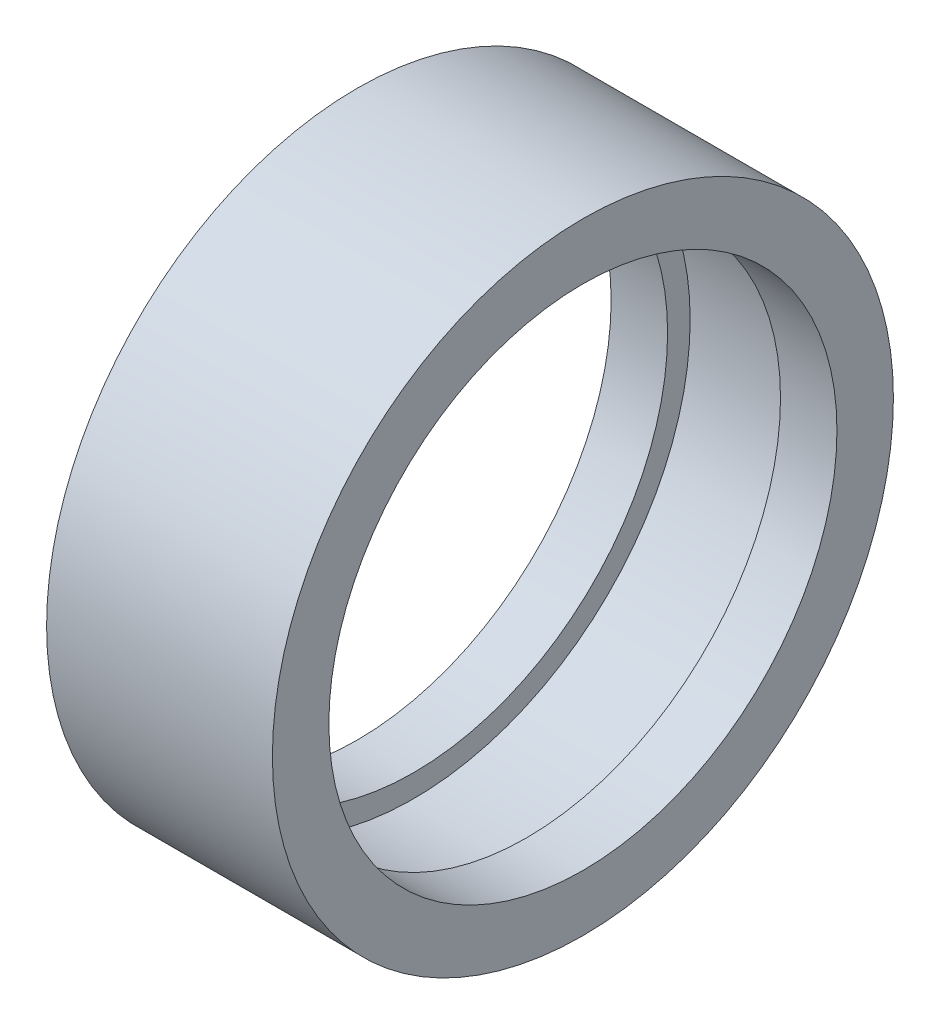
ISO-10303-21;
HEADER;
FILE_DESCRIPTION(('STEP AP214'),'2;1');
FILE_NAME('part.step','',(''),(''),'','','');
FILE_SCHEMA(('AUTOMOTIVE_DESIGN { 1 0 10303 214 1 1 1 1 }'));
ENDSEC;
DATA;
#1=APPLICATION_CONTEXT('core data for automotive mechanical design processes');
#2=APPLICATION_PROTOCOL_DEFINITION('international standard','automotive_design',2000,#1);
#3=PRODUCT_CONTEXT('',#1,'mechanical');
#4=PRODUCT('Part','Part','',(#3));
#5=PRODUCT_RELATED_PRODUCT_CATEGORY('part','',(#4));
#6=PRODUCT_DEFINITION_FORMATION('','',#4);
#7=PRODUCT_DEFINITION_CONTEXT('part definition',#1,'design');
#8=PRODUCT_DEFINITION('design','',#6,#7);
#9=PRODUCT_DEFINITION_SHAPE('','',#8);
#10=(LENGTH_UNIT() NAMED_UNIT(*) SI_UNIT(.MILLI.,.METRE.));
#11=(NAMED_UNIT(*) PLANE_ANGLE_UNIT() SI_UNIT($,.RADIAN.));
#12=(NAMED_UNIT(*) SI_UNIT($,.STERADIAN.) SOLID_ANGLE_UNIT());
#13=UNCERTAINTY_MEASURE_WITH_UNIT(LENGTH_MEASURE(1.E-05),#10,'distance_accuracy_value','');
#14=(GEOMETRIC_REPRESENTATION_CONTEXT(3) GLOBAL_UNCERTAINTY_ASSIGNED_CONTEXT((#13)) GLOBAL_UNIT_ASSIGNED_CONTEXT((#10,
#11,#12)) REPRESENTATION_CONTEXT('',''));
#15=CARTESIAN_POINT('',(0.,0.,0.));
#16=DIRECTION('',(0.,0.,1.));
#17=DIRECTION('',(1.,0.,0.));
#18=AXIS2_PLACEMENT_3D('',#15,#16,#17);
#19=CARTESIAN_POINT('',(-5.02242152466368,11.,0.));
#20=DIRECTION('',(-1.,0.,0.));
#21=DIRECTION('',(0.,0.,1.));
#22=AXIS2_PLACEMENT_3D('',#19,#20,#21);
#23=PLANE('',#22);
#24=CARTESIAN_POINT('',(-5.02242152466368,0.,0.));
#25=DIRECTION('',(1.,0.,0.));
#26=DIRECTION('',(0.,0.,-1.));
#27=AXIS2_PLACEMENT_3D('',#24,#25,#26);
#28=CIRCLE('',#27,9.);
#29=CARTESIAN_POINT('',(-5.02242152466368,0.,-9.));
#30=VERTEX_POINT('',#29);
#31=EDGE_CURVE('E10',#30,#30,#28,.T.);
#32=ORIENTED_EDGE('',*,*,#31,.T.);
#33=EDGE_LOOP('',(#32));
#34=FACE_BOUND('',#33,.T.);
#35=CARTESIAN_POINT('',(-5.02242152466368,0.,0.));
#36=DIRECTION('',(1.,0.,0.));
#37=DIRECTION('',(0.,0.,-1.));
#38=AXIS2_PLACEMENT_3D('',#35,#36,#37);
#39=CIRCLE('',#38,11.);
#40=CARTESIAN_POINT('',(-5.02242152466368,0.,-11.));
#41=VERTEX_POINT('',#40);
#42=EDGE_CURVE('E62',#41,#41,#39,.T.);
#43=ORIENTED_EDGE('',*,*,#42,.F.);
#44=EDGE_LOOP('',(#43));
#45=FACE_BOUND('',#44,.T.);
#46=ADVANCED_FACE('F34',(#34,#45),#23,.T.);
#47=CARTESIAN_POINT('',(0.,0.,0.));
#48=DIRECTION('',(1.,0.,0.));
#49=DIRECTION('',(0.,0.,-1.));
#50=AXIS2_PLACEMENT_3D('',#47,#48,#49);
#51=CYLINDRICAL_SURFACE('',#50,9.);
#52=CARTESIAN_POINT('',(-3.02242152466368,0.,0.));
#53=DIRECTION('',(1.,0.,0.));
#54=DIRECTION('',(0.,0.,-1.));
#55=AXIS2_PLACEMENT_3D('',#52,#53,#54);
#56=CIRCLE('',#55,9.);
#57=CARTESIAN_POINT('',(-3.02242152466368,0.,-9.));
#58=VERTEX_POINT('',#57);
#59=EDGE_CURVE('E40',#58,#58,#56,.T.);
#60=ORIENTED_EDGE('',*,*,#59,.T.);
#61=EDGE_LOOP('',(#60));
#62=FACE_BOUND('',#61,.T.);
#63=ORIENTED_EDGE('',*,*,#31,.F.);
#64=EDGE_LOOP('',(#63));
#65=FACE_BOUND('',#64,.T.);
#66=ADVANCED_FACE('F70',(#62,#65),#51,.F.);
#67=CARTESIAN_POINT('',(-3.02242152466368,9.,0.));
#68=DIRECTION('',(1.,0.,0.));
#69=DIRECTION('',(0.,0.,-1.));
#70=AXIS2_PLACEMENT_3D('',#67,#68,#69);
#71=PLANE('',#70);
#72=CARTESIAN_POINT('',(-3.02242152466368,0.,0.));
#73=DIRECTION('',(1.,0.,0.));
#74=DIRECTION('',(0.,0.,-1.));
#75=AXIS2_PLACEMENT_3D('',#72,#73,#74);
#76=CIRCLE('',#75,9.8);
#77=CARTESIAN_POINT('',(-3.02242152466368,0.,-9.8));
#78=VERTEX_POINT('',#77);
#79=EDGE_CURVE('E44',#78,#78,#76,.T.);
#80=ORIENTED_EDGE('',*,*,#79,.T.);
#81=EDGE_LOOP('',(#80));
#82=FACE_BOUND('',#81,.T.);
#83=ORIENTED_EDGE('',*,*,#59,.F.);
#84=EDGE_LOOP('',(#83));
#85=FACE_BOUND('',#84,.T.);
#86=ADVANCED_FACE('F74',(#82,#85),#71,.T.);
#87=CARTESIAN_POINT('',(0.,0.,0.));
#88=DIRECTION('',(1.,0.,0.));
#89=DIRECTION('',(0.,0.,-1.));
#90=AXIS2_PLACEMENT_3D('',#87,#88,#89);
#91=CYLINDRICAL_SURFACE('',#90,9.8);
#92=CARTESIAN_POINT('',(0.977578475336324,0.,0.));
#93=DIRECTION('',(1.,0.,0.));
#94=DIRECTION('',(0.,0.,-1.));
#95=AXIS2_PLACEMENT_3D('',#92,#93,#94);
#96=CIRCLE('',#95,9.8);
#97=CARTESIAN_POINT('',(0.977578475336324,0.,-9.8));
#98=VERTEX_POINT('',#97);
#99=EDGE_CURVE('E48',#98,#98,#96,.T.);
#100=ORIENTED_EDGE('',*,*,#99,.T.);
#101=EDGE_LOOP('',(#100));
#102=FACE_BOUND('',#101,.T.);
#103=ORIENTED_EDGE('',*,*,#79,.F.);
#104=EDGE_LOOP('',(#103));
#105=FACE_BOUND('',#104,.T.);
#106=ADVANCED_FACE('F78',(#102,#105),#91,.F.);
#107=CARTESIAN_POINT('',(0.977578475336324,9.8,0.));
#108=DIRECTION('',(-1.,0.,0.));
#109=DIRECTION('',(0.,0.,1.));
#110=AXIS2_PLACEMENT_3D('',#107,#108,#109);
#111=PLANE('',#110);
#112=CARTESIAN_POINT('',(0.977578475336324,0.,0.));
#113=DIRECTION('',(1.,0.,0.));
#114=DIRECTION('',(0.,0.,-1.));
#115=AXIS2_PLACEMENT_3D('',#112,#113,#114);
#116=CIRCLE('',#115,9.);
#117=CARTESIAN_POINT('',(0.977578475336324,0.,-9.));
#118=VERTEX_POINT('',#117);
#119=EDGE_CURVE('E53',#118,#118,#116,.T.);
#120=ORIENTED_EDGE('',*,*,#119,.T.);
#121=EDGE_LOOP('',(#120));
#122=FACE_BOUND('',#121,.T.);
#123=ORIENTED_EDGE('',*,*,#99,.F.);
#124=EDGE_LOOP('',(#123));
#125=FACE_BOUND('',#124,.T.);
#126=ADVANCED_FACE('F85',(#122,#125),#111,.T.);
#127=CARTESIAN_POINT('',(0.,0.,0.));
#128=DIRECTION('',(1.,0.,0.));
#129=DIRECTION('',(0.,0.,-1.));
#130=AXIS2_PLACEMENT_3D('',#127,#128,#129);
#131=CYLINDRICAL_SURFACE('',#130,9.);
#132=CARTESIAN_POINT('',(2.97757847533632,0.,0.));
#133=DIRECTION('',(1.,0.,0.));
#134=DIRECTION('',(0.,0.,-1.));
#135=AXIS2_PLACEMENT_3D('',#132,#133,#134);
#136=CIRCLE('',#135,9.);
#137=CARTESIAN_POINT('',(2.97757847533632,0.,-9.));
#138=VERTEX_POINT('',#137);
#139=EDGE_CURVE('E56',#138,#138,#136,.T.);
#140=ORIENTED_EDGE('',*,*,#139,.T.);
#141=EDGE_LOOP('',(#140));
#142=FACE_BOUND('',#141,.T.);
#143=ORIENTED_EDGE('',*,*,#119,.F.);
#144=EDGE_LOOP('',(#143));
#145=FACE_BOUND('',#144,.T.);
#146=ADVANCED_FACE('F89',(#142,#145),#131,.F.);
#147=CARTESIAN_POINT('',(2.97757847533632,11.,0.));
#148=DIRECTION('',(1.,0.,0.));
#149=DIRECTION('',(0.,0.,-1.));
#150=AXIS2_PLACEMENT_3D('',#147,#148,#149);
#151=PLANE('',#150);
#152=CARTESIAN_POINT('',(2.97757847533632,0.,0.));
#153=DIRECTION('',(1.,0.,0.));
#154=DIRECTION('',(0.,0.,-1.));
#155=AXIS2_PLACEMENT_3D('',#152,#153,#154);
#156=CIRCLE('',#155,11.);
#157=CARTESIAN_POINT('',(2.97757847533632,0.,-11.));
#158=VERTEX_POINT('',#157);
#159=EDGE_CURVE('E59',#158,#158,#156,.T.);
#160=ORIENTED_EDGE('',*,*,#159,.T.);
#161=EDGE_LOOP('',(#160));
#162=FACE_BOUND('',#161,.T.);
#163=ORIENTED_EDGE('',*,*,#139,.F.);
#164=EDGE_LOOP('',(#163));
#165=FACE_BOUND('',#164,.T.);
#166=ADVANCED_FACE('F93',(#162,#165),#151,.T.);
#167=CARTESIAN_POINT('',(0.,0.,0.));
#168=DIRECTION('',(1.,0.,0.));
#169=DIRECTION('',(0.,0.,-1.));
#170=AXIS2_PLACEMENT_3D('',#167,#168,#169);
#171=CYLINDRICAL_SURFACE('',#170,11.);
#172=ORIENTED_EDGE('',*,*,#42,.T.);
#173=EDGE_LOOP('',(#172));
#174=FACE_BOUND('',#173,.T.);
#175=ORIENTED_EDGE('',*,*,#159,.F.);
#176=EDGE_LOOP('',(#175));
#177=FACE_BOUND('',#176,.T.);
#178=ADVANCED_FACE('F66',(#174,#177),#171,.T.);
#179=CLOSED_SHELL('',(#46,#66,#86,#106,#126,#146,#166,#178));
#180=MANIFOLD_SOLID_BREP('B2',#179);
#181=ADVANCED_BREP_SHAPE_REPRESENTATION('',(#18,#180),#14);
#182=SHAPE_DEFINITION_REPRESENTATION(#9,#181);
ENDSEC;
END-ISO-10303-21;
